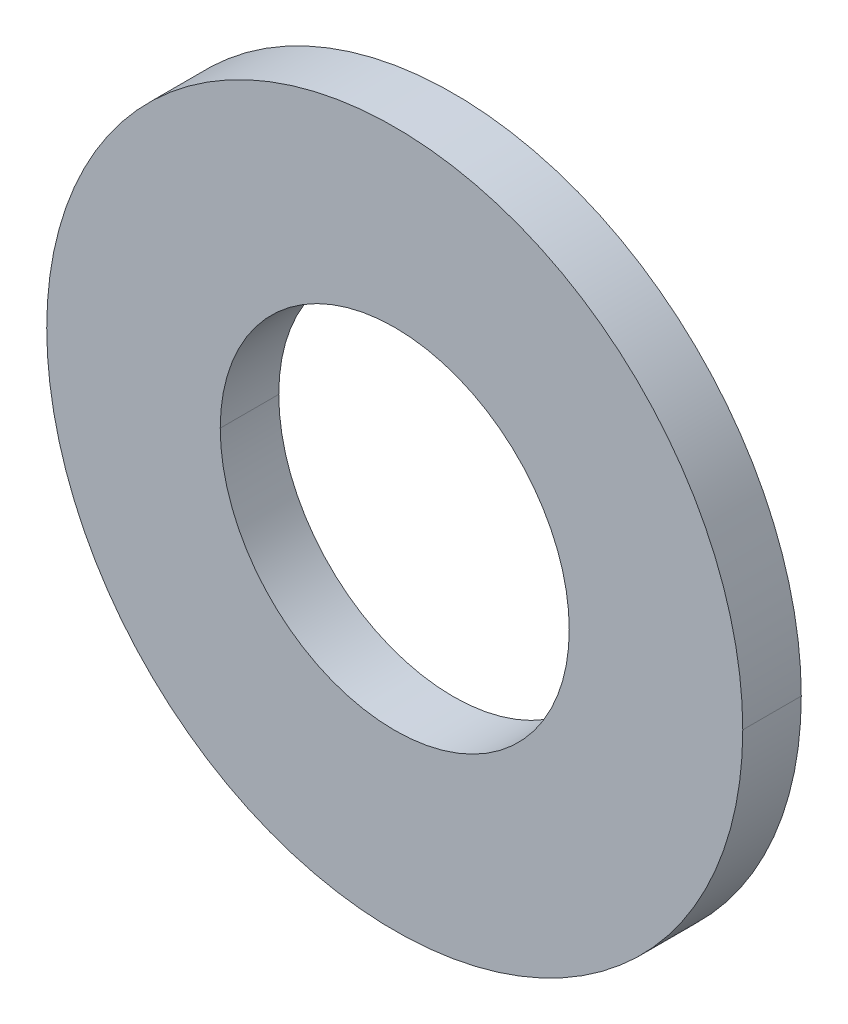
ISO-10303-21;
HEADER;
FILE_DESCRIPTION(('STEP AP214'),'2;1');
FILE_NAME('part.step','',(''),(''),'','','');
FILE_SCHEMA(('AUTOMOTIVE_DESIGN { 1 0 10303 214 1 1 1 1 }'));
ENDSEC;
DATA;
#1=APPLICATION_CONTEXT('core data for automotive mechanical design processes');
#2=APPLICATION_PROTOCOL_DEFINITION('international standard','automotive_design',2000,#1);
#3=PRODUCT_CONTEXT('',#1,'mechanical');
#4=PRODUCT('Part','Part','',(#3));
#5=PRODUCT_RELATED_PRODUCT_CATEGORY('part','',(#4));
#6=PRODUCT_DEFINITION_FORMATION('','',#4);
#7=PRODUCT_DEFINITION_CONTEXT('part definition',#1,'design');
#8=PRODUCT_DEFINITION('design','',#6,#7);
#9=PRODUCT_DEFINITION_SHAPE('','',#8);
#10=(LENGTH_UNIT() NAMED_UNIT(*) SI_UNIT(.MILLI.,.METRE.));
#11=(NAMED_UNIT(*) PLANE_ANGLE_UNIT() SI_UNIT($,.RADIAN.));
#12=(NAMED_UNIT(*) SI_UNIT($,.STERADIAN.) SOLID_ANGLE_UNIT());
#13=UNCERTAINTY_MEASURE_WITH_UNIT(LENGTH_MEASURE(1.E-05),#10,'distance_accuracy_value','');
#14=(GEOMETRIC_REPRESENTATION_CONTEXT(3) GLOBAL_UNCERTAINTY_ASSIGNED_CONTEXT((#13)) GLOBAL_UNIT_ASSIGNED_CONTEXT((#10,
#11,#12)) REPRESENTATION_CONTEXT('',''));
#15=CARTESIAN_POINT('',(0.,0.,0.));
#16=DIRECTION('',(0.,0.,1.));
#17=DIRECTION('',(1.,0.,0.));
#18=AXIS2_PLACEMENT_3D('',#15,#16,#17);
#19=CARTESIAN_POINT('',(0.,0.,1.4732));
#20=DIRECTION('',(0.,0.,-1.));
#21=DIRECTION('',(-1.,0.,0.));
#22=AXIS2_PLACEMENT_3D('',#19,#20,#21);
#23=CYLINDRICAL_SURFACE('',#22,8.763);
#24=CARTESIAN_POINT('',(0.,0.,1.4732));
#25=DIRECTION('',(0.,0.,-1.));
#26=DIRECTION('',(1.,0.,0.));
#27=AXIS2_PLACEMENT_3D('',#24,#25,#26);
#28=CIRCLE('',#27,8.763);
#29=CARTESIAN_POINT('',(-8.763,0.,1.4732));
#30=VERTEX_POINT('',#29);
#31=CARTESIAN_POINT('',(8.763,0.,1.4732));
#32=VERTEX_POINT('',#31);
#33=EDGE_CURVE('E11',#30,#32,#28,.T.);
#34=ORIENTED_EDGE('',*,*,#33,.T.);
#35=DIRECTION('',(0.,0.,-1.));
#36=VECTOR('',#35,1.);
#37=CARTESIAN_POINT('',(8.763,0.,1.4732));
#38=LINE('',#37,#36);
#39=CARTESIAN_POINT('',(8.763,0.,0.));
#40=VERTEX_POINT('',#39);
#41=EDGE_CURVE('E27',#32,#40,#38,.T.);
#42=ORIENTED_EDGE('',*,*,#41,.T.);
#43=CARTESIAN_POINT('',(0.,0.,0.));
#44=DIRECTION('',(0.,0.,-1.));
#45=DIRECTION('',(1.,0.,0.));
#46=AXIS2_PLACEMENT_3D('',#43,#44,#45);
#47=CIRCLE('',#46,8.763);
#48=CARTESIAN_POINT('',(-8.763,0.,0.));
#49=VERTEX_POINT('',#48);
#50=EDGE_CURVE('E105',#49,#40,#47,.T.);
#51=ORIENTED_EDGE('',*,*,#50,.F.);
#52=DIRECTION('',(0.,0.,-1.));
#53=VECTOR('',#52,1.);
#54=CARTESIAN_POINT('',(-8.763,0.,1.4732));
#55=LINE('',#54,#53);
#56=EDGE_CURVE('E100',#30,#49,#55,.T.);
#57=ORIENTED_EDGE('',*,*,#56,.F.);
#58=EDGE_LOOP('',(#34,#42,#51,#57));
#59=FACE_BOUND('',#58,.T.);
#60=ADVANCED_FACE('F16',(#59),#23,.T.);
#61=CARTESIAN_POINT('',(0.,0.,1.4732));
#62=DIRECTION('',(0.,0.,-1.));
#63=DIRECTION('',(-1.,0.,0.));
#64=AXIS2_PLACEMENT_3D('',#61,#62,#63);
#65=CYLINDRICAL_SURFACE('',#64,4.3942);
#66=CARTESIAN_POINT('',(0.,0.,1.4732));
#67=DIRECTION('',(0.,0.,-1.));
#68=DIRECTION('',(1.,0.,0.));
#69=AXIS2_PLACEMENT_3D('',#66,#67,#68);
#70=CIRCLE('',#69,4.3942);
#71=CARTESIAN_POINT('',(4.3942,0.,1.4732));
#72=VERTEX_POINT('',#71);
#73=CARTESIAN_POINT('',(-4.3942,0.,1.4732));
#74=VERTEX_POINT('',#73);
#75=EDGE_CURVE('E68',#72,#74,#70,.T.);
#76=ORIENTED_EDGE('',*,*,#75,.F.);
#77=DIRECTION('',(0.,0.,-1.));
#78=VECTOR('',#77,1.);
#79=CARTESIAN_POINT('',(4.3942,0.,1.4732));
#80=LINE('',#79,#78);
#81=CARTESIAN_POINT('',(4.3942,0.,0.));
#82=VERTEX_POINT('',#81);
#83=EDGE_CURVE('E88',#72,#82,#80,.T.);
#84=ORIENTED_EDGE('',*,*,#83,.T.);
#85=CARTESIAN_POINT('',(0.,0.,0.));
#86=DIRECTION('',(0.,0.,-1.));
#87=DIRECTION('',(1.,0.,0.));
#88=AXIS2_PLACEMENT_3D('',#85,#86,#87);
#89=CIRCLE('',#88,4.3942);
#90=CARTESIAN_POINT('',(-4.3942,0.,0.));
#91=VERTEX_POINT('',#90);
#92=EDGE_CURVE('E20',#82,#91,#89,.T.);
#93=ORIENTED_EDGE('',*,*,#92,.T.);
#94=DIRECTION('',(0.,0.,-1.));
#95=VECTOR('',#94,1.);
#96=CARTESIAN_POINT('',(-4.3942,0.,1.4732));
#97=LINE('',#96,#95);
#98=EDGE_CURVE('E77',#74,#91,#97,.T.);
#99=ORIENTED_EDGE('',*,*,#98,.F.);
#100=EDGE_LOOP('',(#76,#84,#93,#99));
#101=FACE_BOUND('',#100,.T.);
#102=ADVANCED_FACE('F87',(#101),#65,.F.);
#103=CARTESIAN_POINT('',(0.,0.,1.4732));
#104=DIRECTION('',(0.,0.,-1.));
#105=DIRECTION('',(-1.,0.,0.));
#106=AXIS2_PLACEMENT_3D('',#103,#104,#105);
#107=CYLINDRICAL_SURFACE('',#106,4.3942);
#108=ORIENTED_EDGE('',*,*,#83,.F.);
#109=CARTESIAN_POINT('',(0.,0.,1.4732));
#110=DIRECTION('',(0.,0.,-1.));
#111=DIRECTION('',(1.,0.,0.));
#112=AXIS2_PLACEMENT_3D('',#109,#110,#111);
#113=CIRCLE('',#112,4.3942);
#114=EDGE_CURVE('E82',#74,#72,#113,.T.);
#115=ORIENTED_EDGE('',*,*,#114,.F.);
#116=ORIENTED_EDGE('',*,*,#98,.T.);
#117=CARTESIAN_POINT('',(0.,0.,0.));
#118=DIRECTION('',(0.,0.,-1.));
#119=DIRECTION('',(1.,0.,0.));
#120=AXIS2_PLACEMENT_3D('',#117,#118,#119);
#121=CIRCLE('',#120,4.3942);
#122=EDGE_CURVE('E81',#91,#82,#121,.T.);
#123=ORIENTED_EDGE('',*,*,#122,.T.);
#124=EDGE_LOOP('',(#108,#115,#116,#123));
#125=FACE_BOUND('',#124,.T.);
#126=ADVANCED_FACE('F18',(#125),#107,.F.);
#127=CARTESIAN_POINT('',(0.,0.,1.4732));
#128=DIRECTION('',(0.,0.,-1.));
#129=DIRECTION('',(-1.,0.,0.));
#130=AXIS2_PLACEMENT_3D('',#127,#128,#129);
#131=CYLINDRICAL_SURFACE('',#130,8.763);
#132=ORIENTED_EDGE('',*,*,#41,.F.);
#133=CARTESIAN_POINT('',(0.,0.,1.4732));
#134=DIRECTION('',(0.,0.,-1.));
#135=DIRECTION('',(1.,0.,0.));
#136=AXIS2_PLACEMENT_3D('',#133,#134,#135);
#137=CIRCLE('',#136,8.763);
#138=EDGE_CURVE('E93',#32,#30,#137,.T.);
#139=ORIENTED_EDGE('',*,*,#138,.T.);
#140=ORIENTED_EDGE('',*,*,#56,.T.);
#141=CARTESIAN_POINT('',(0.,0.,0.));
#142=DIRECTION('',(0.,0.,-1.));
#143=DIRECTION('',(1.,0.,0.));
#144=AXIS2_PLACEMENT_3D('',#141,#142,#143);
#145=CIRCLE('',#144,8.763);
#146=EDGE_CURVE('E103',#40,#49,#145,.T.);
#147=ORIENTED_EDGE('',*,*,#146,.F.);
#148=EDGE_LOOP('',(#132,#139,#140,#147));
#149=FACE_BOUND('',#148,.T.);
#150=ADVANCED_FACE('F185',(#149),#131,.T.);
#151=CARTESIAN_POINT('',(0.,0.,1.4732));
#152=DIRECTION('',(0.,0.,-1.));
#153=DIRECTION('',(0.,-1.,0.));
#154=AXIS2_PLACEMENT_3D('',#151,#152,#153);
#155=PLANE('',#154);
#156=ORIENTED_EDGE('',*,*,#33,.F.);
#157=ORIENTED_EDGE('',*,*,#138,.F.);
#158=EDGE_LOOP('',(#156,#157));
#159=FACE_BOUND('',#158,.T.);
#160=ORIENTED_EDGE('',*,*,#114,.T.);
#161=ORIENTED_EDGE('',*,*,#75,.T.);
#162=EDGE_LOOP('',(#160,#161));
#163=FACE_BOUND('',#162,.T.);
#164=ADVANCED_FACE('F163',(#159,#163),#155,.F.);
#165=CARTESIAN_POINT('',(0.,0.,0.));
#166=DIRECTION('',(0.,0.,-1.));
#167=DIRECTION('',(0.,-1.,0.));
#168=AXIS2_PLACEMENT_3D('',#165,#166,#167);
#169=PLANE('',#168);
#170=ORIENTED_EDGE('',*,*,#50,.T.);
#171=ORIENTED_EDGE('',*,*,#146,.T.);
#172=EDGE_LOOP('',(#170,#171));
#173=FACE_BOUND('',#172,.T.);
#174=ORIENTED_EDGE('',*,*,#122,.F.);
#175=ORIENTED_EDGE('',*,*,#92,.F.);
#176=EDGE_LOOP('',(#174,#175));
#177=FACE_BOUND('',#176,.T.);
#178=ADVANCED_FACE('F91',(#173,#177),#169,.T.);
#179=CLOSED_SHELL('',(#60,#102,#126,#150,#164,#178));
#180=MANIFOLD_SOLID_BREP('B1',#179);
#181=ADVANCED_BREP_SHAPE_REPRESENTATION('',(#18,#180),#14);
#182=SHAPE_DEFINITION_REPRESENTATION(#9,#181);
ENDSEC;
END-ISO-10303-21;
